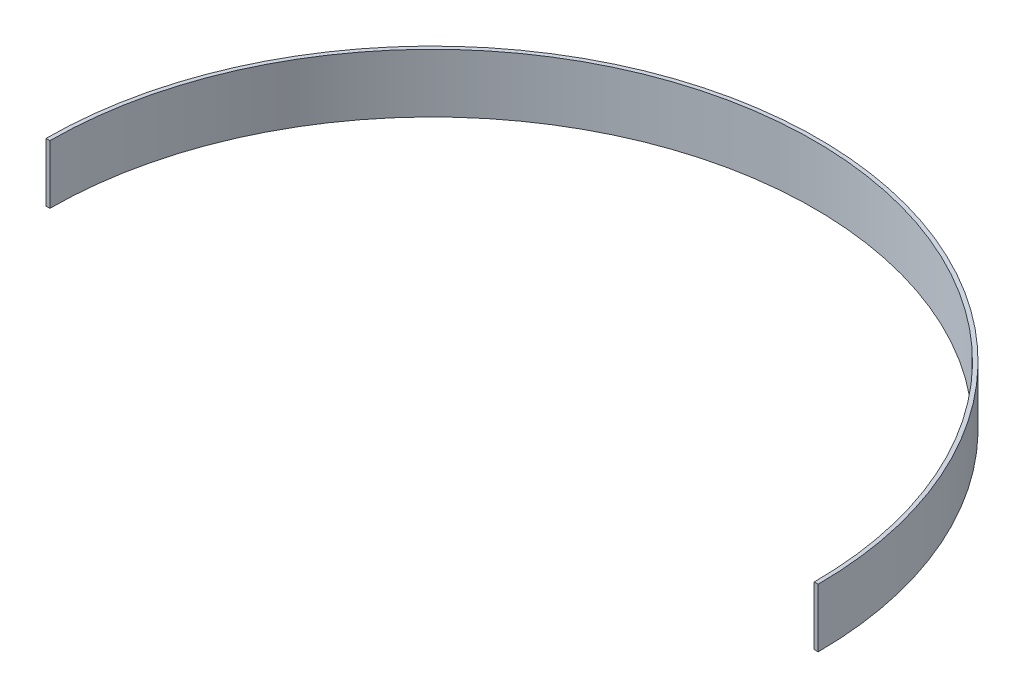
ISO-10303-21;
HEADER;
FILE_DESCRIPTION(('STEP AP214'),'2;1');
FILE_NAME('part.step','',(''),(''),'','','');
FILE_SCHEMA(('AUTOMOTIVE_DESIGN { 1 0 10303 214 1 1 1 1 }'));
ENDSEC;
DATA;
#1=APPLICATION_CONTEXT('core data for automotive mechanical design processes');
#2=APPLICATION_PROTOCOL_DEFINITION('international standard','automotive_design',2000,#1);
#3=PRODUCT_CONTEXT('',#1,'mechanical');
#4=PRODUCT('Part','Part','',(#3));
#5=PRODUCT_RELATED_PRODUCT_CATEGORY('part','',(#4));
#6=PRODUCT_DEFINITION_FORMATION('','',#4);
#7=PRODUCT_DEFINITION_CONTEXT('part definition',#1,'design');
#8=PRODUCT_DEFINITION('design','',#6,#7);
#9=PRODUCT_DEFINITION_SHAPE('','',#8);
#10=(LENGTH_UNIT() NAMED_UNIT(*) SI_UNIT(.MILLI.,.METRE.));
#11=(NAMED_UNIT(*) PLANE_ANGLE_UNIT() SI_UNIT($,.RADIAN.));
#12=(NAMED_UNIT(*) SI_UNIT($,.STERADIAN.) SOLID_ANGLE_UNIT());
#13=UNCERTAINTY_MEASURE_WITH_UNIT(LENGTH_MEASURE(1.E-05),#10,'distance_accuracy_value','');
#14=(GEOMETRIC_REPRESENTATION_CONTEXT(3) GLOBAL_UNCERTAINTY_ASSIGNED_CONTEXT((#13)) GLOBAL_UNIT_ASSIGNED_CONTEXT((#10,
#11,#12)) REPRESENTATION_CONTEXT('',''));
#15=CARTESIAN_POINT('',(0.,0.,0.));
#16=DIRECTION('',(0.,0.,1.));
#17=DIRECTION('',(1.,0.,0.));
#18=AXIS2_PLACEMENT_3D('',#15,#16,#17);
#19=CARTESIAN_POINT('',(0.,75.0000000000011,0.));
#20=DIRECTION('',(0.,1.,0.));
#21=DIRECTION('',(0.,0.,1.));
#22=AXIS2_PLACEMENT_3D('',#19,#20,#21);
#23=PLANE('',#22);
#24=DIRECTION('',(-1.,0.,0.));
#25=VECTOR('',#24,1.);
#26=CARTESIAN_POINT('',(-987.5,75.0000000000011,1.03393849049768E-13));
#27=LINE('',#26,#25);
#28=CARTESIAN_POINT('',(-977.5,75.000000000002,1.01556878851047E-13));
#29=VERTEX_POINT('',#28);
#30=CARTESIAN_POINT('',(-987.5,75.0000000000011,1.03393849049768E-13));
#31=VERTEX_POINT('',#30);
#32=EDGE_CURVE('E11',#29,#31,#27,.T.);
#33=ORIENTED_EDGE('',*,*,#32,.F.);
#34=CARTESIAN_POINT('',(0.,75.000000000002,0.));
#35=DIRECTION('',(0.,-1.,0.));
#36=DIRECTION('',(0.,0.,-1.));
#37=AXIS2_PLACEMENT_3D('',#34,#35,#36);
#38=CIRCLE('',#37,977.5);
#39=CARTESIAN_POINT('',(977.5,75.000000000002,5.28835346247319E-12));
#40=VERTEX_POINT('',#39);
#41=EDGE_CURVE('E72',#29,#40,#38,.T.);
#42=ORIENTED_EDGE('',*,*,#41,.T.);
#43=DIRECTION('',(1.,0.,0.));
#44=VECTOR('',#43,1.);
#45=CARTESIAN_POINT('',(987.5,75.0000000000011,6.00105943239528E-12));
#46=LINE('',#45,#44);
#47=CARTESIAN_POINT('',(987.5,75.0000000000011,6.00105943239528E-12));
#48=VERTEX_POINT('',#47);
#49=EDGE_CURVE('E46',#40,#48,#46,.T.);
#50=ORIENTED_EDGE('',*,*,#49,.T.);
#51=CARTESIAN_POINT('',(0.,75.0000000000011,0.));
#52=DIRECTION('',(0.,-1.,0.));
#53=DIRECTION('',(0.,0.,-1.));
#54=AXIS2_PLACEMENT_3D('',#51,#52,#53);
#55=CIRCLE('',#54,987.5);
#56=EDGE_CURVE('E75',#31,#48,#55,.T.);
#57=ORIENTED_EDGE('',*,*,#56,.F.);
#58=EDGE_LOOP('',(#33,#42,#50,#57));
#59=FACE_BOUND('',#58,.T.);
#60=ADVANCED_FACE('F36',(#59),#23,.T.);
#61=CARTESIAN_POINT('',(987.5,8.88178419700125E-13,5.32065359483674E-12));
#62=DIRECTION('',(0.,0.,1.));
#63=DIRECTION('',(0.,-1.,0.));
#64=AXIS2_PLACEMENT_3D('',#61,#62,#63);
#65=PLANE('',#64);
#66=ORIENTED_EDGE('',*,*,#49,.F.);
#67=DIRECTION('',(0.,-1.,0.));
#68=VECTOR('',#67,1.);
#69=CARTESIAN_POINT('',(977.5,3083.16004345462,5.28835346247319E-12));
#70=LINE('',#69,#68);
#71=CARTESIAN_POINT('',(977.5,-74.9999999999984,5.28835346247319E-12));
#72=VERTEX_POINT('',#71);
#73=EDGE_CURVE('E87',#40,#72,#70,.T.);
#74=ORIENTED_EDGE('',*,*,#73,.T.);
#75=DIRECTION('',(1.,0.,0.));
#76=VECTOR('',#75,1.);
#77=CARTESIAN_POINT('',(987.5,-74.9999999999993,4.88211550010981E-12));
#78=LINE('',#77,#76);
#79=CARTESIAN_POINT('',(987.5,-74.9999999999993,4.88211550010981E-12));
#80=VERTEX_POINT('',#79);
#81=EDGE_CURVE('E96',#72,#80,#78,.T.);
#82=ORIENTED_EDGE('',*,*,#81,.T.);
#83=DIRECTION('',(0.,-1.,0.));
#84=VECTOR('',#83,1.);
#85=CARTESIAN_POINT('',(987.5,75.0000000000011,5.75919168956368E-12));
#86=LINE('',#85,#84);
#87=EDGE_CURVE('E91',#48,#80,#86,.T.);
#88=ORIENTED_EDGE('',*,*,#87,.F.);
#89=EDGE_LOOP('',(#66,#74,#82,#88));
#90=FACE_BOUND('',#89,.T.);
#91=ADVANCED_FACE('F104',(#90),#65,.T.);
#92=CARTESIAN_POINT('',(0.,-74.9999999999993,0.));
#93=DIRECTION('',(0.,-1.,0.));
#94=DIRECTION('',(0.,0.,-1.));
#95=AXIS2_PLACEMENT_3D('',#92,#93,#94);
#96=PLANE('',#95);
#97=ORIENTED_EDGE('',*,*,#81,.F.);
#98=CARTESIAN_POINT('',(0.,-74.9999999999984,0.));
#99=DIRECTION('',(0.,-1.,0.));
#100=DIRECTION('',(0.,0.,-1.));
#101=AXIS2_PLACEMENT_3D('',#98,#99,#100);
#102=CIRCLE('',#101,977.5);
#103=CARTESIAN_POINT('',(-977.5,-74.9999999999984,1.01556878851047E-13));
#104=VERTEX_POINT('',#103);
#105=EDGE_CURVE('E89',#72,#104,#102,.F.);
#106=ORIENTED_EDGE('',*,*,#105,.T.);
#107=DIRECTION('',(-1.,0.,0.));
#108=VECTOR('',#107,1.);
#109=CARTESIAN_POINT('',(-987.5,-74.9999999999993,-2.59407765197635E-13));
#110=LINE('',#109,#108);
#111=CARTESIAN_POINT('',(-987.5,-74.9999999999993,-2.59407765197635E-13));
#112=VERTEX_POINT('',#111);
#113=EDGE_CURVE('E40',#104,#112,#110,.T.);
#114=ORIENTED_EDGE('',*,*,#113,.T.);
#115=CARTESIAN_POINT('',(0.,-74.9999999999993,0.));
#116=DIRECTION('',(0.,1.,0.));
#117=DIRECTION('',(0.,0.,1.));
#118=AXIS2_PLACEMENT_3D('',#115,#116,#117);
#119=CIRCLE('',#118,987.5);
#120=EDGE_CURVE('E105',#80,#112,#119,.T.);
#121=ORIENTED_EDGE('',*,*,#120,.F.);
#122=EDGE_LOOP('',(#97,#106,#114,#121));
#123=FACE_BOUND('',#122,.T.);
#124=ADVANCED_FACE('F109',(#123),#96,.T.);
#125=CARTESIAN_POINT('',(-987.5,8.88178419700125E-13,1.03393849049768E-13));
#126=DIRECTION('',(0.,0.,1.));
#127=DIRECTION('',(0.,1.,0.));
#128=AXIS2_PLACEMENT_3D('',#125,#126,#127);
#129=PLANE('',#128);
#130=DIRECTION('',(0.,-1.,0.));
#131=VECTOR('',#130,1.);
#132=CARTESIAN_POINT('',(-977.5,3083.16004345462,1.01556878851047E-13));
#133=LINE('',#132,#131);
#134=EDGE_CURVE('E85',#104,#29,#133,.F.);
#135=ORIENTED_EDGE('',*,*,#134,.T.);
#136=ORIENTED_EDGE('',*,*,#32,.T.);
#137=DIRECTION('',(0.,1.,0.));
#138=VECTOR('',#137,1.);
#139=CARTESIAN_POINT('',(-987.5,-74.9999999999993,1.03393849049768E-13));
#140=LINE('',#139,#138);
#141=EDGE_CURVE('E103',#112,#31,#140,.T.);
#142=ORIENTED_EDGE('',*,*,#141,.F.);
#143=ORIENTED_EDGE('',*,*,#113,.F.);
#144=EDGE_LOOP('',(#135,#136,#142,#143));
#145=FACE_BOUND('',#144,.T.);
#146=ADVANCED_FACE('F38',(#145),#129,.T.);
#147=CARTESIAN_POINT('',(0.,3083.16004345462,0.));
#148=DIRECTION('',(0.,-1.,0.));
#149=DIRECTION('',(0.,0.,-1.));
#150=AXIS2_PLACEMENT_3D('',#147,#148,#149);
#151=CYLINDRICAL_SURFACE('',#150,987.5);
#152=ORIENTED_EDGE('',*,*,#120,.T.);
#153=ORIENTED_EDGE('',*,*,#141,.T.);
#154=ORIENTED_EDGE('',*,*,#56,.T.);
#155=ORIENTED_EDGE('',*,*,#87,.T.);
#156=EDGE_LOOP('',(#152,#153,#154,#155));
#157=FACE_BOUND('',#156,.T.);
#158=ADVANCED_FACE('F102',(#157),#151,.T.);
#159=CARTESIAN_POINT('',(0.,3083.16004345462,0.));
#160=DIRECTION('',(0.,-1.,0.));
#161=DIRECTION('',(0.,0.,-1.));
#162=AXIS2_PLACEMENT_3D('',#159,#160,#161);
#163=CYLINDRICAL_SURFACE('',#162,977.5);
#164=ORIENTED_EDGE('',*,*,#105,.F.);
#165=ORIENTED_EDGE('',*,*,#73,.F.);
#166=ORIENTED_EDGE('',*,*,#41,.F.);
#167=ORIENTED_EDGE('',*,*,#134,.F.);
#168=EDGE_LOOP('',(#164,#165,#166,#167));
#169=FACE_BOUND('',#168,.T.);
#170=ADVANCED_FACE('F84',(#169),#163,.F.);
#171=CLOSED_SHELL('',(#60,#91,#124,#146,#158,#170));
#172=MANIFOLD_SOLID_BREP('B2',#171);
#173=ADVANCED_BREP_SHAPE_REPRESENTATION('',(#18,#172),#14);
#174=SHAPE_DEFINITION_REPRESENTATION(#9,#173);
ENDSEC;
END-ISO-10303-21;
